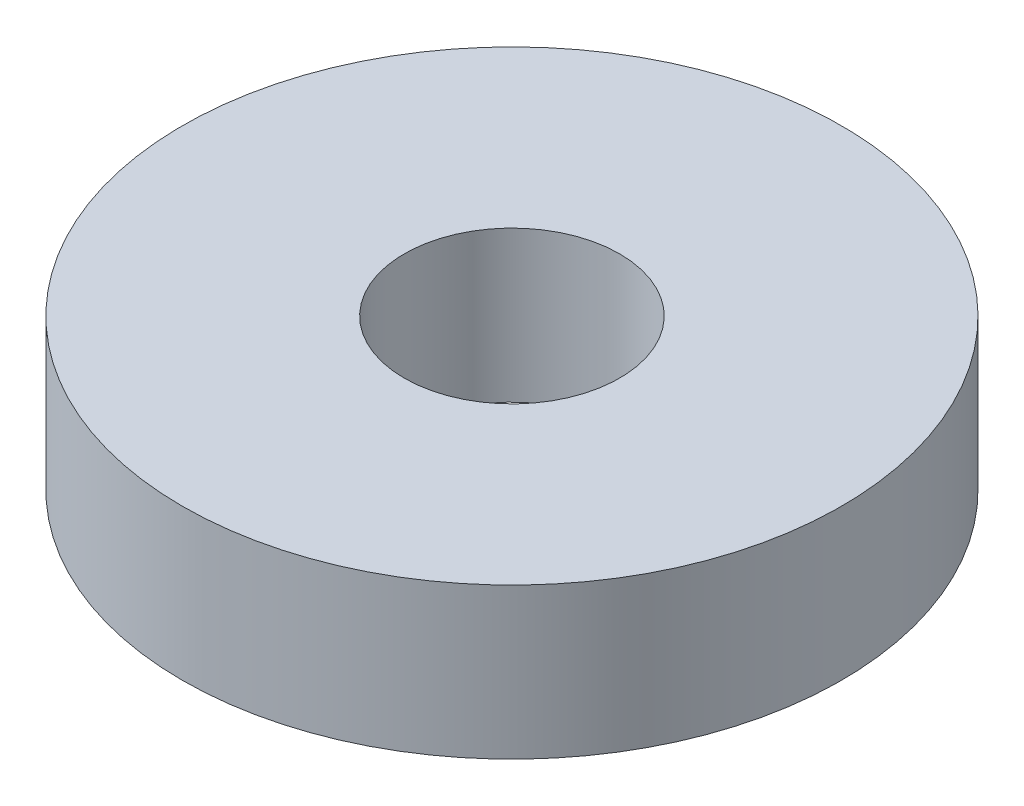
ISO-10303-21;
HEADER;
FILE_DESCRIPTION(('STEP AP214'),'2;1');
FILE_NAME('part.step','',(''),(''),'','','');
FILE_SCHEMA(('AUTOMOTIVE_DESIGN { 1 0 10303 214 1 1 1 1 }'));
ENDSEC;
DATA;
#1=APPLICATION_CONTEXT('core data for automotive mechanical design processes');
#2=APPLICATION_PROTOCOL_DEFINITION('international standard','automotive_design',2000,#1);
#3=PRODUCT_CONTEXT('',#1,'mechanical');
#4=PRODUCT('Part','Part','',(#3));
#5=PRODUCT_RELATED_PRODUCT_CATEGORY('part','',(#4));
#6=PRODUCT_DEFINITION_FORMATION('','',#4);
#7=PRODUCT_DEFINITION_CONTEXT('part definition',#1,'design');
#8=PRODUCT_DEFINITION('design','',#6,#7);
#9=PRODUCT_DEFINITION_SHAPE('','',#8);
#10=(LENGTH_UNIT() NAMED_UNIT(*) SI_UNIT(.MILLI.,.METRE.));
#11=(NAMED_UNIT(*) PLANE_ANGLE_UNIT() SI_UNIT($,.RADIAN.));
#12=(NAMED_UNIT(*) SI_UNIT($,.STERADIAN.) SOLID_ANGLE_UNIT());
#13=UNCERTAINTY_MEASURE_WITH_UNIT(LENGTH_MEASURE(1.E-05),#10,'distance_accuracy_value','');
#14=(GEOMETRIC_REPRESENTATION_CONTEXT(3) GLOBAL_UNCERTAINTY_ASSIGNED_CONTEXT((#13)) GLOBAL_UNIT_ASSIGNED_CONTEXT((#10,
#11,#12)) REPRESENTATION_CONTEXT('',''));
#15=CARTESIAN_POINT('',(0.,0.,0.));
#16=DIRECTION('',(0.,0.,1.));
#17=DIRECTION('',(1.,0.,0.));
#18=AXIS2_PLACEMENT_3D('',#15,#16,#17);
#19=CARTESIAN_POINT('',(0.,3.5,0.));
#20=DIRECTION('',(0.,1.,0.));
#21=DIRECTION('',(0.,0.,1.));
#22=AXIS2_PLACEMENT_3D('',#19,#20,#21);
#23=PLANE('',#22);
#24=CARTESIAN_POINT('',(0.,3.5,0.));
#25=DIRECTION('',(0.,1.,0.));
#26=DIRECTION('',(0.,0.,1.));
#27=AXIS2_PLACEMENT_3D('',#24,#25,#26);
#28=CIRCLE('',#27,7.65);
#29=CARTESIAN_POINT('',(0.,3.5,7.65));
#30=VERTEX_POINT('',#29);
#31=EDGE_CURVE('E10',#30,#30,#28,.T.);
#32=ORIENTED_EDGE('',*,*,#31,.T.);
#33=EDGE_LOOP('',(#32));
#34=FACE_BOUND('',#33,.T.);
#35=CARTESIAN_POINT('',(0.,3.5,0.));
#36=DIRECTION('',(0.,1.,0.));
#37=DIRECTION('',(0.,0.,1.));
#38=AXIS2_PLACEMENT_3D('',#35,#36,#37);
#39=CIRCLE('',#38,2.5);
#40=CARTESIAN_POINT('',(0.,3.5,2.5));
#41=VERTEX_POINT('',#40);
#42=EDGE_CURVE('E52',#41,#41,#39,.T.);
#43=ORIENTED_EDGE('',*,*,#42,.F.);
#44=EDGE_LOOP('',(#43));
#45=FACE_BOUND('',#44,.T.);
#46=ADVANCED_FACE('F41',(#34,#45),#23,.T.);
#47=CARTESIAN_POINT('',(0.,0.,0.));
#48=DIRECTION('',(0.,1.,0.));
#49=DIRECTION('',(0.,0.,1.));
#50=AXIS2_PLACEMENT_3D('',#47,#48,#49);
#51=PLANE('',#50);
#52=CARTESIAN_POINT('',(0.,0.,0.));
#53=DIRECTION('',(0.,1.,0.));
#54=DIRECTION('',(0.,0.,1.));
#55=AXIS2_PLACEMENT_3D('',#52,#53,#54);
#56=CIRCLE('',#55,7.65);
#57=CARTESIAN_POINT('',(0.,0.,7.65));
#58=VERTEX_POINT('',#57);
#59=EDGE_CURVE('E45',#58,#58,#56,.T.);
#60=ORIENTED_EDGE('',*,*,#59,.F.);
#61=EDGE_LOOP('',(#60));
#62=FACE_BOUND('',#61,.T.);
#63=CARTESIAN_POINT('',(0.,0.,0.));
#64=DIRECTION('',(0.,1.,0.));
#65=DIRECTION('',(0.,0.,1.));
#66=AXIS2_PLACEMENT_3D('',#63,#64,#65);
#67=CIRCLE('',#66,2.5);
#68=CARTESIAN_POINT('',(0.,0.,2.5));
#69=VERTEX_POINT('',#68);
#70=EDGE_CURVE('E54',#69,#69,#67,.T.);
#71=ORIENTED_EDGE('',*,*,#70,.T.);
#72=EDGE_LOOP('',(#71));
#73=FACE_BOUND('',#72,.T.);
#74=ADVANCED_FACE('F64',(#62,#73),#51,.F.);
#75=CARTESIAN_POINT('',(0.,3.5,0.));
#76=DIRECTION('',(0.,-1.,0.));
#77=DIRECTION('',(0.,0.,-1.));
#78=AXIS2_PLACEMENT_3D('',#75,#76,#77);
#79=CYLINDRICAL_SURFACE('',#78,7.65);
#80=ORIENTED_EDGE('',*,*,#31,.F.);
#81=EDGE_LOOP('',(#80));
#82=FACE_BOUND('',#81,.T.);
#83=ORIENTED_EDGE('',*,*,#59,.T.);
#84=EDGE_LOOP('',(#83));
#85=FACE_BOUND('',#84,.T.);
#86=ADVANCED_FACE('F43',(#82,#85),#79,.T.);
#87=CARTESIAN_POINT('',(0.,3.5,0.));
#88=DIRECTION('',(0.,-1.,0.));
#89=DIRECTION('',(0.,0.,-1.));
#90=AXIS2_PLACEMENT_3D('',#87,#88,#89);
#91=CYLINDRICAL_SURFACE('',#90,2.5);
#92=ORIENTED_EDGE('',*,*,#42,.T.);
#93=EDGE_LOOP('',(#92));
#94=FACE_BOUND('',#93,.T.);
#95=ORIENTED_EDGE('',*,*,#70,.F.);
#96=EDGE_LOOP('',(#95));
#97=FACE_BOUND('',#96,.T.);
#98=ADVANCED_FACE('F60',(#94,#97),#91,.F.);
#99=CLOSED_SHELL('',(#46,#74,#86,#98));
#100=MANIFOLD_SOLID_BREP('B2',#99);
#101=ADVANCED_BREP_SHAPE_REPRESENTATION('',(#18,#100),#14);
#102=SHAPE_DEFINITION_REPRESENTATION(#9,#101);
ENDSEC;
END-ISO-10303-21;
